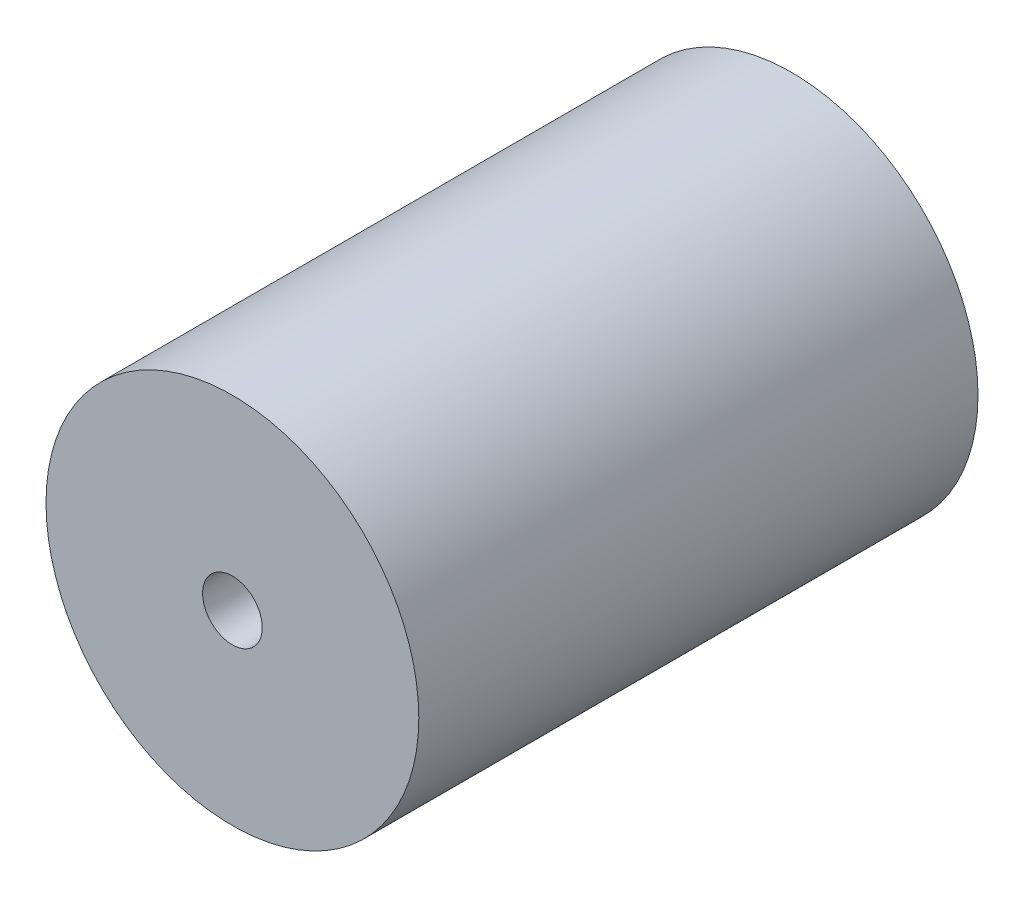
ISO-10303-21;
HEADER;
FILE_DESCRIPTION(('STEP AP214'),'2;1');
FILE_NAME('part.step','',(''),(''),'','','');
FILE_SCHEMA(('AUTOMOTIVE_DESIGN { 1 0 10303 214 1 1 1 1 }'));
ENDSEC;
DATA;
#1=APPLICATION_CONTEXT('core data for automotive mechanical design processes');
#2=APPLICATION_PROTOCOL_DEFINITION('international standard','automotive_design',2000,#1);
#3=PRODUCT_CONTEXT('',#1,'mechanical');
#4=PRODUCT('Part','Part','',(#3));
#5=PRODUCT_RELATED_PRODUCT_CATEGORY('part','',(#4));
#6=PRODUCT_DEFINITION_FORMATION('','',#4);
#7=PRODUCT_DEFINITION_CONTEXT('part definition',#1,'design');
#8=PRODUCT_DEFINITION('design','',#6,#7);
#9=PRODUCT_DEFINITION_SHAPE('','',#8);
#10=(LENGTH_UNIT() NAMED_UNIT(*) SI_UNIT(.MILLI.,.METRE.));
#11=(NAMED_UNIT(*) PLANE_ANGLE_UNIT() SI_UNIT($,.RADIAN.));
#12=(NAMED_UNIT(*) SI_UNIT($,.STERADIAN.) SOLID_ANGLE_UNIT());
#13=UNCERTAINTY_MEASURE_WITH_UNIT(LENGTH_MEASURE(1.E-05),#10,'distance_accuracy_value','');
#14=(GEOMETRIC_REPRESENTATION_CONTEXT(3) GLOBAL_UNCERTAINTY_ASSIGNED_CONTEXT((#13)) GLOBAL_UNIT_ASSIGNED_CONTEXT((#10,
#11,#12)) REPRESENTATION_CONTEXT('',''));
#15=CARTESIAN_POINT('',(0.,0.,0.));
#16=DIRECTION('',(0.,0.,1.));
#17=DIRECTION('',(1.,0.,0.));
#18=AXIS2_PLACEMENT_3D('',#15,#16,#17);
#19=CARTESIAN_POINT('',(0.,0.,100.));
#20=DIRECTION('',(0.,0.,-1.));
#21=DIRECTION('',(-1.,0.,0.));
#22=AXIS2_PLACEMENT_3D('',#19,#20,#21);
#23=CYLINDRICAL_SURFACE('',#22,25.);
#24=CARTESIAN_POINT('',(0.,0.,100.));
#25=DIRECTION('',(0.,0.,1.));
#26=DIRECTION('',(1.,0.,0.));
#27=AXIS2_PLACEMENT_3D('',#24,#25,#26);
#28=CIRCLE('',#27,25.);
#29=CARTESIAN_POINT('',(25.,0.,100.));
#30=VERTEX_POINT('',#29);
#31=EDGE_CURVE('E10',#30,#30,#28,.T.);
#32=ORIENTED_EDGE('',*,*,#31,.F.);
#33=EDGE_LOOP('',(#32));
#34=FACE_BOUND('',#33,.T.);
#35=CARTESIAN_POINT('',(0.,0.,25.));
#36=DIRECTION('',(0.,0.,-1.));
#37=DIRECTION('',(-1.,0.,0.));
#38=AXIS2_PLACEMENT_3D('',#35,#36,#37);
#39=CIRCLE('',#38,25.);
#40=CARTESIAN_POINT('',(-25.,0.,25.));
#41=VERTEX_POINT('',#40);
#42=EDGE_CURVE('E46',#41,#41,#39,.T.);
#43=ORIENTED_EDGE('',*,*,#42,.F.);
#44=EDGE_LOOP('',(#43));
#45=FACE_BOUND('',#44,.T.);
#46=ADVANCED_FACE('F31',(#34,#45),#23,.T.);
#47=CARTESIAN_POINT('',(0.,0.,100.));
#48=DIRECTION('',(0.,0.,1.));
#49=DIRECTION('',(1.,0.,0.));
#50=AXIS2_PLACEMENT_3D('',#47,#48,#49);
#51=PLANE('',#50);
#52=CARTESIAN_POINT('',(0.,0.,100.));
#53=DIRECTION('',(0.,0.,1.));
#54=DIRECTION('',(1.,0.,0.));
#55=AXIS2_PLACEMENT_3D('',#52,#53,#54);
#56=CIRCLE('',#55,4.);
#57=CARTESIAN_POINT('',(4.,0.,100.));
#58=VERTEX_POINT('',#57);
#59=EDGE_CURVE('E41',#58,#58,#56,.T.);
#60=ORIENTED_EDGE('',*,*,#59,.F.);
#61=EDGE_LOOP('',(#60));
#62=FACE_BOUND('',#61,.T.);
#63=ORIENTED_EDGE('',*,*,#31,.T.);
#64=EDGE_LOOP('',(#63));
#65=FACE_BOUND('',#64,.T.);
#66=ADVANCED_FACE('F54',(#62,#65),#51,.T.);
#67=CARTESIAN_POINT('',(0.,0.,92.));
#68=DIRECTION('',(0.,0.,1.));
#69=DIRECTION('',(1.,0.,0.));
#70=AXIS2_PLACEMENT_3D('',#67,#68,#69);
#71=CYLINDRICAL_SURFACE('',#70,4.);
#72=CARTESIAN_POINT('',(0.,0.,92.));
#73=DIRECTION('',(0.,0.,1.));
#74=DIRECTION('',(1.,0.,0.));
#75=AXIS2_PLACEMENT_3D('',#72,#73,#74);
#76=CIRCLE('',#75,4.);
#77=CARTESIAN_POINT('',(4.,0.,92.));
#78=VERTEX_POINT('',#77);
#79=EDGE_CURVE('E37',#78,#78,#76,.T.);
#80=ORIENTED_EDGE('',*,*,#79,.F.);
#81=EDGE_LOOP('',(#80));
#82=FACE_BOUND('',#81,.T.);
#83=ORIENTED_EDGE('',*,*,#59,.T.);
#84=EDGE_LOOP('',(#83));
#85=FACE_BOUND('',#84,.T.);
#86=ADVANCED_FACE('F61',(#82,#85),#71,.F.);
#87=CARTESIAN_POINT('',(0.,0.,92.));
#88=DIRECTION('',(0.,0.,1.));
#89=DIRECTION('',(1.,0.,0.));
#90=AXIS2_PLACEMENT_3D('',#87,#88,#89);
#91=PLANE('',#90);
#92=ORIENTED_EDGE('',*,*,#79,.T.);
#93=EDGE_LOOP('',(#92));
#94=FACE_BOUND('',#93,.T.);
#95=ADVANCED_FACE('F66',(#94),#91,.T.);
#96=CARTESIAN_POINT('',(0.,0.,25.));
#97=DIRECTION('',(0.,0.,-1.));
#98=DIRECTION('',(-1.,0.,0.));
#99=AXIS2_PLACEMENT_3D('',#96,#97,#98);
#100=PLANE('',#99);
#101=ORIENTED_EDGE('',*,*,#42,.T.);
#102=EDGE_LOOP('',(#101));
#103=FACE_BOUND('',#102,.T.);
#104=ADVANCED_FACE('F51',(#103),#100,.T.);
#105=CLOSED_SHELL('',(#46,#66,#86,#95,#104));
#106=MANIFOLD_SOLID_BREP('B2',#105);
#107=ADVANCED_BREP_SHAPE_REPRESENTATION('',(#18,#106),#14);
#108=SHAPE_DEFINITION_REPRESENTATION(#9,#107);
ENDSEC;
END-ISO-10303-21;
